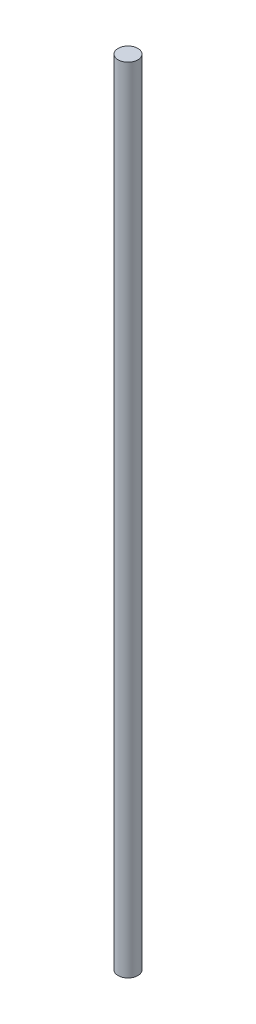
ISO-10303-21;
HEADER;
FILE_DESCRIPTION(('STEP AP214'),'2;1');
FILE_NAME('part.step','',(''),(''),'','','');
FILE_SCHEMA(('AUTOMOTIVE_DESIGN { 1 0 10303 214 1 1 1 1 }'));
ENDSEC;
DATA;
#1=APPLICATION_CONTEXT('core data for automotive mechanical design processes');
#2=APPLICATION_PROTOCOL_DEFINITION('international standard','automotive_design',2000,#1);
#3=PRODUCT_CONTEXT('',#1,'mechanical');
#4=PRODUCT('Part','Part','',(#3));
#5=PRODUCT_RELATED_PRODUCT_CATEGORY('part','',(#4));
#6=PRODUCT_DEFINITION_FORMATION('','',#4);
#7=PRODUCT_DEFINITION_CONTEXT('part definition',#1,'design');
#8=PRODUCT_DEFINITION('design','',#6,#7);
#9=PRODUCT_DEFINITION_SHAPE('','',#8);
#10=(LENGTH_UNIT() NAMED_UNIT(*) SI_UNIT(.MILLI.,.METRE.));
#11=(NAMED_UNIT(*) PLANE_ANGLE_UNIT() SI_UNIT($,.RADIAN.));
#12=(NAMED_UNIT(*) SI_UNIT($,.STERADIAN.) SOLID_ANGLE_UNIT());
#13=UNCERTAINTY_MEASURE_WITH_UNIT(LENGTH_MEASURE(1.E-05),#10,'distance_accuracy_value','');
#14=(GEOMETRIC_REPRESENTATION_CONTEXT(3) GLOBAL_UNCERTAINTY_ASSIGNED_CONTEXT((#13)) GLOBAL_UNIT_ASSIGNED_CONTEXT((#10,
#11,#12)) REPRESENTATION_CONTEXT('',''));
#15=CARTESIAN_POINT('',(0.,0.,0.));
#16=DIRECTION('',(0.,0.,1.));
#17=DIRECTION('',(1.,0.,0.));
#18=AXIS2_PLACEMENT_3D('',#15,#16,#17);
#19=CARTESIAN_POINT('',(0.,120.,0.));
#20=DIRECTION('',(0.,-1.,0.));
#21=DIRECTION('',(0.,0.,-1.));
#22=AXIS2_PLACEMENT_3D('',#19,#20,#21);
#23=CYLINDRICAL_SURFACE('',#22,1.5);
#24=CARTESIAN_POINT('',(0.,120.,0.));
#25=DIRECTION('',(0.,1.,0.));
#26=DIRECTION('',(0.,0.,1.));
#27=AXIS2_PLACEMENT_3D('',#24,#25,#26);
#28=CIRCLE('',#27,1.5);
#29=CARTESIAN_POINT('',(0.,120.,1.5));
#30=VERTEX_POINT('',#29);
#31=EDGE_CURVE('E10',#30,#30,#28,.T.);
#32=ORIENTED_EDGE('',*,*,#31,.F.);
#33=EDGE_LOOP('',(#32));
#34=FACE_BOUND('',#33,.T.);
#35=CARTESIAN_POINT('',(0.,0.,0.));
#36=DIRECTION('',(0.,1.,0.));
#37=DIRECTION('',(0.,0.,1.));
#38=AXIS2_PLACEMENT_3D('',#35,#36,#37);
#39=CIRCLE('',#38,1.5);
#40=CARTESIAN_POINT('',(0.,0.,1.5));
#41=VERTEX_POINT('',#40);
#42=EDGE_CURVE('E44',#41,#41,#39,.T.);
#43=ORIENTED_EDGE('',*,*,#42,.T.);
#44=EDGE_LOOP('',(#43));
#45=FACE_BOUND('',#44,.T.);
#46=ADVANCED_FACE('F41',(#34,#45),#23,.T.);
#47=CARTESIAN_POINT('',(0.,120.,0.));
#48=DIRECTION('',(0.,1.,0.));
#49=DIRECTION('',(0.,0.,1.));
#50=AXIS2_PLACEMENT_3D('',#47,#48,#49);
#51=PLANE('',#50);
#52=ORIENTED_EDGE('',*,*,#31,.T.);
#53=EDGE_LOOP('',(#52));
#54=FACE_BOUND('',#53,.T.);
#55=ADVANCED_FACE('F58',(#54),#51,.T.);
#56=CARTESIAN_POINT('',(0.,0.,0.));
#57=DIRECTION('',(0.,1.,0.));
#58=DIRECTION('',(0.,0.,1.));
#59=AXIS2_PLACEMENT_3D('',#56,#57,#58);
#60=PLANE('',#59);
#61=ORIENTED_EDGE('',*,*,#42,.F.);
#62=EDGE_LOOP('',(#61));
#63=FACE_BOUND('',#62,.T.);
#64=ADVANCED_FACE('F56',(#63),#60,.F.);
#65=CLOSED_SHELL('',(#46,#55,#64));
#66=MANIFOLD_SOLID_BREP('B2',#65);
#67=ADVANCED_BREP_SHAPE_REPRESENTATION('',(#18,#66),#14);
#68=SHAPE_DEFINITION_REPRESENTATION(#9,#67);
ENDSEC;
END-ISO-10303-21;
